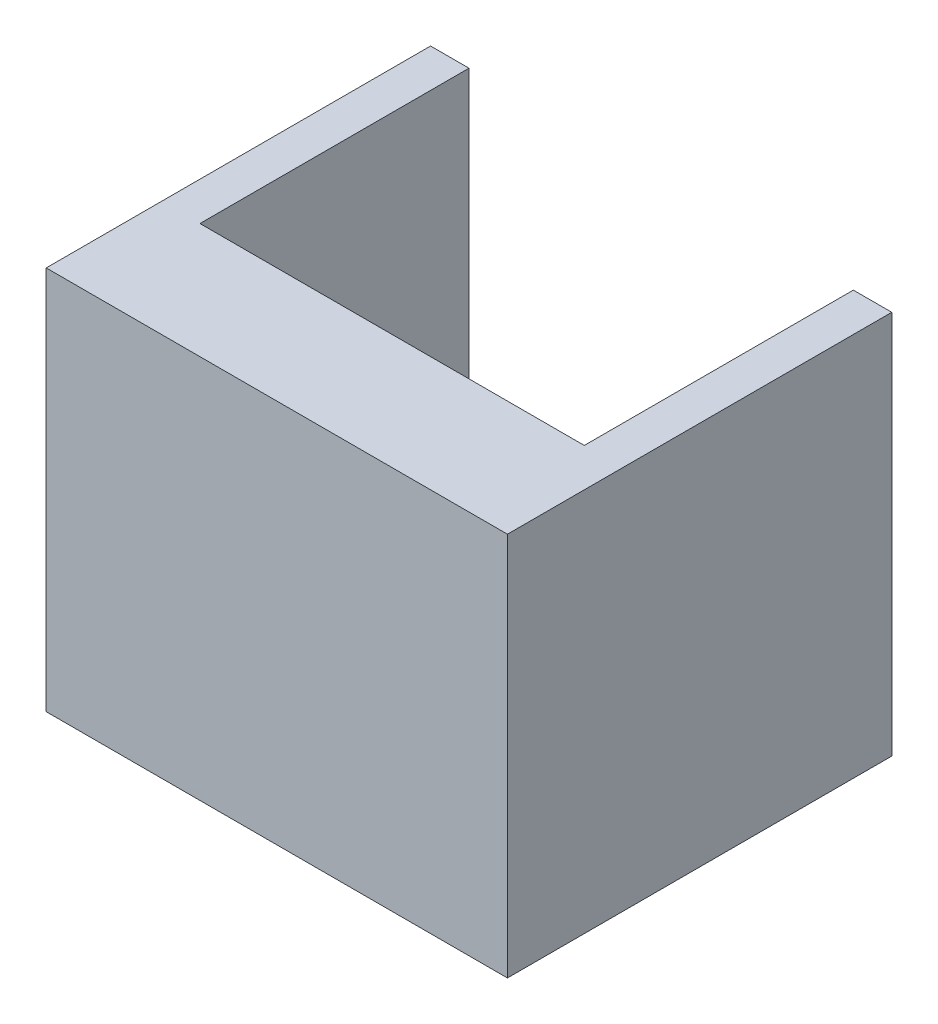
ISO-10303-21;
HEADER;
FILE_DESCRIPTION(('STEP AP214'),'2;1');
FILE_NAME('part.step','',(''),(''),'','','');
FILE_SCHEMA(('AUTOMOTIVE_DESIGN { 1 0 10303 214 1 1 1 1 }'));
ENDSEC;
DATA;
#1=APPLICATION_CONTEXT('core data for automotive mechanical design processes');
#2=APPLICATION_PROTOCOL_DEFINITION('international standard','automotive_design',2000,#1);
#3=PRODUCT_CONTEXT('',#1,'mechanical');
#4=PRODUCT('Part','Part','',(#3));
#5=PRODUCT_RELATED_PRODUCT_CATEGORY('part','',(#4));
#6=PRODUCT_DEFINITION_FORMATION('','',#4);
#7=PRODUCT_DEFINITION_CONTEXT('part definition',#1,'design');
#8=PRODUCT_DEFINITION('design','',#6,#7);
#9=PRODUCT_DEFINITION_SHAPE('','',#8);
#10=(LENGTH_UNIT() NAMED_UNIT(*) SI_UNIT(.MILLI.,.METRE.));
#11=(NAMED_UNIT(*) PLANE_ANGLE_UNIT() SI_UNIT($,.RADIAN.));
#12=(NAMED_UNIT(*) SI_UNIT($,.STERADIAN.) SOLID_ANGLE_UNIT());
#13=UNCERTAINTY_MEASURE_WITH_UNIT(LENGTH_MEASURE(1.E-05),#10,'distance_accuracy_value','');
#14=(GEOMETRIC_REPRESENTATION_CONTEXT(3) GLOBAL_UNCERTAINTY_ASSIGNED_CONTEXT((#13)) GLOBAL_UNIT_ASSIGNED_CONTEXT((#10,
#11,#12)) REPRESENTATION_CONTEXT('',''));
#15=CARTESIAN_POINT('',(0.,0.,0.));
#16=DIRECTION('',(0.,0.,1.));
#17=DIRECTION('',(1.,0.,0.));
#18=AXIS2_PLACEMENT_3D('',#15,#16,#17);
#19=CARTESIAN_POINT('',(3.59999999999999,10.,-5.11132252557189));
#20=DIRECTION('',(1.,0.,0.));
#21=DIRECTION('',(0.,0.,-1.));
#22=AXIS2_PLACEMENT_3D('',#19,#20,#21);
#23=PLANE('',#22);
#24=DIRECTION('',(0.,0.,1.));
#25=VECTOR('',#24,1.);
#26=CARTESIAN_POINT('',(3.59999999999999,0.,-5.11132252557189));
#27=LINE('',#26,#25);
#28=CARTESIAN_POINT('',(3.59999999999999,0.,-5.11132252557189));
#29=VERTEX_POINT('',#28);
#30=CARTESIAN_POINT('',(3.59999999999999,0.,4.88867747442811));
#31=VERTEX_POINT('',#30);
#32=EDGE_CURVE('E129',#29,#31,#27,.T.);
#33=ORIENTED_EDGE('',*,*,#32,.T.);
#34=DIRECTION('',(0.,-1.,0.));
#35=VECTOR('',#34,1.);
#36=CARTESIAN_POINT('',(3.59999999999999,10.,4.88867747442811));
#37=LINE('',#36,#35);
#38=CARTESIAN_POINT('',(3.59999999999999,10.,4.88867747442811));
#39=VERTEX_POINT('',#38);
#40=EDGE_CURVE('E11',#39,#31,#37,.T.);
#41=ORIENTED_EDGE('',*,*,#40,.F.);
#42=DIRECTION('',(0.,0.,1.));
#43=VECTOR('',#42,1.);
#44=CARTESIAN_POINT('',(3.59999999999999,10.,-5.11132252557189));
#45=LINE('',#44,#43);
#46=CARTESIAN_POINT('',(3.59999999999999,10.,-5.11132252557189));
#47=VERTEX_POINT('',#46);
#48=EDGE_CURVE('E143',#47,#39,#45,.T.);
#49=ORIENTED_EDGE('',*,*,#48,.F.);
#50=DIRECTION('',(0.,-1.,0.));
#51=VECTOR('',#50,1.);
#52=CARTESIAN_POINT('',(3.59999999999999,10.,-5.11132252557189));
#53=LINE('',#52,#51);
#54=EDGE_CURVE('E125',#47,#29,#53,.T.);
#55=ORIENTED_EDGE('',*,*,#54,.T.);
#56=EDGE_LOOP('',(#33,#41,#49,#55));
#57=FACE_BOUND('',#56,.T.);
#58=ADVANCED_FACE('F33',(#57),#23,.F.);
#59=CARTESIAN_POINT('',(3.59999999999999,10.,4.88867747442811));
#60=DIRECTION('',(0.,0.,-1.));
#61=DIRECTION('',(-1.,0.,0.));
#62=AXIS2_PLACEMENT_3D('',#59,#60,#61);
#63=PLANE('',#62);
#64=DIRECTION('',(1.,0.,0.));
#65=VECTOR('',#64,1.);
#66=CARTESIAN_POINT('',(3.59999999999999,0.,4.88867747442811));
#67=LINE('',#66,#65);
#68=CARTESIAN_POINT('',(15.6,0.,4.88867747442811));
#69=VERTEX_POINT('',#68);
#70=EDGE_CURVE('E132',#31,#69,#67,.T.);
#71=ORIENTED_EDGE('',*,*,#70,.T.);
#72=DIRECTION('',(0.,-1.,0.));
#73=VECTOR('',#72,1.);
#74=CARTESIAN_POINT('',(15.6,10.,4.88867747442811));
#75=LINE('',#74,#73);
#76=CARTESIAN_POINT('',(15.6,10.,4.88867747442811));
#77=VERTEX_POINT('',#76);
#78=EDGE_CURVE('E41',#77,#69,#75,.T.);
#79=ORIENTED_EDGE('',*,*,#78,.F.);
#80=DIRECTION('',(1.,0.,0.));
#81=VECTOR('',#80,1.);
#82=CARTESIAN_POINT('',(3.59999999999999,10.,4.88867747442811));
#83=LINE('',#82,#81);
#84=EDGE_CURVE('E92',#39,#77,#83,.T.);
#85=ORIENTED_EDGE('',*,*,#84,.F.);
#86=ORIENTED_EDGE('',*,*,#40,.T.);
#87=EDGE_LOOP('',(#71,#79,#85,#86));
#88=FACE_BOUND('',#87,.T.);
#89=ADVANCED_FACE('F178',(#88),#63,.F.);
#90=CARTESIAN_POINT('',(15.6,10.,-5.11132252557189));
#91=DIRECTION('',(-1.,0.,0.));
#92=DIRECTION('',(0.,0.,1.));
#93=AXIS2_PLACEMENT_3D('',#90,#91,#92);
#94=PLANE('',#93);
#95=DIRECTION('',(0.,0.,-1.));
#96=VECTOR('',#95,1.);
#97=CARTESIAN_POINT('',(15.6,0.,-5.11132252557189));
#98=LINE('',#97,#96);
#99=CARTESIAN_POINT('',(15.6,0.,-5.11132252557189));
#100=VERTEX_POINT('',#99);
#101=EDGE_CURVE('E134',#69,#100,#98,.T.);
#102=ORIENTED_EDGE('',*,*,#101,.T.);
#103=DIRECTION('',(0.,-1.,0.));
#104=VECTOR('',#103,1.);
#105=CARTESIAN_POINT('',(15.6,10.,-5.11132252557189));
#106=LINE('',#105,#104);
#107=CARTESIAN_POINT('',(15.6,10.,-5.11132252557189));
#108=VERTEX_POINT('',#107);
#109=EDGE_CURVE('E150',#108,#100,#106,.T.);
#110=ORIENTED_EDGE('',*,*,#109,.F.);
#111=DIRECTION('',(0.,0.,-1.));
#112=VECTOR('',#111,1.);
#113=CARTESIAN_POINT('',(15.6,10.,-5.11132252557189));
#114=LINE('',#113,#112);
#115=EDGE_CURVE('E158',#77,#108,#114,.T.);
#116=ORIENTED_EDGE('',*,*,#115,.F.);
#117=ORIENTED_EDGE('',*,*,#78,.T.);
#118=EDGE_LOOP('',(#102,#110,#116,#117));
#119=FACE_BOUND('',#118,.T.);
#120=ADVANCED_FACE('F156',(#119),#94,.F.);
#121=CARTESIAN_POINT('',(14.6,10.,-5.11132252557189));
#122=DIRECTION('',(0.,0.,1.));
#123=DIRECTION('',(1.,0.,0.));
#124=AXIS2_PLACEMENT_3D('',#121,#122,#123);
#125=PLANE('',#124);
#126=DIRECTION('',(-1.,0.,0.));
#127=VECTOR('',#126,1.);
#128=CARTESIAN_POINT('',(14.6,0.,-5.11132252557189));
#129=LINE('',#128,#127);
#130=CARTESIAN_POINT('',(14.6,0.,-5.11132252557189));
#131=VERTEX_POINT('',#130);
#132=EDGE_CURVE('E136',#100,#131,#129,.T.);
#133=ORIENTED_EDGE('',*,*,#132,.T.);
#134=DIRECTION('',(0.,-1.,0.));
#135=VECTOR('',#134,1.);
#136=CARTESIAN_POINT('',(14.6,10.,-5.11132252557189));
#137=LINE('',#136,#135);
#138=CARTESIAN_POINT('',(14.6,10.,-5.11132252557189));
#139=VERTEX_POINT('',#138);
#140=EDGE_CURVE('E147',#139,#131,#137,.T.);
#141=ORIENTED_EDGE('',*,*,#140,.F.);
#142=DIRECTION('',(-1.,0.,0.));
#143=VECTOR('',#142,1.);
#144=CARTESIAN_POINT('',(14.6,10.,-5.11132252557189));
#145=LINE('',#144,#143);
#146=EDGE_CURVE('E170',#108,#139,#145,.T.);
#147=ORIENTED_EDGE('',*,*,#146,.F.);
#148=ORIENTED_EDGE('',*,*,#109,.T.);
#149=EDGE_LOOP('',(#133,#141,#147,#148));
#150=FACE_BOUND('',#149,.T.);
#151=ADVANCED_FACE('F166',(#150),#125,.F.);
#152=CARTESIAN_POINT('',(14.6,10.,-5.11132252557189));
#153=DIRECTION('',(1.,0.,0.));
#154=DIRECTION('',(0.,0.,-1.));
#155=AXIS2_PLACEMENT_3D('',#152,#153,#154);
#156=PLANE('',#155);
#157=DIRECTION('',(0.,0.,1.));
#158=VECTOR('',#157,1.);
#159=CARTESIAN_POINT('',(14.6,0.,-5.11132252557189));
#160=LINE('',#159,#158);
#161=CARTESIAN_POINT('',(14.6,0.,1.88867747442811));
#162=VERTEX_POINT('',#161);
#163=EDGE_CURVE('E138',#131,#162,#160,.T.);
#164=ORIENTED_EDGE('',*,*,#163,.T.);
#165=DIRECTION('',(0.,-1.,0.));
#166=VECTOR('',#165,1.);
#167=CARTESIAN_POINT('',(14.6,10.,1.88867747442811));
#168=LINE('',#167,#166);
#169=CARTESIAN_POINT('',(14.6,10.,1.88867747442811));
#170=VERTEX_POINT('',#169);
#171=EDGE_CURVE('E120',#170,#162,#168,.T.);
#172=ORIENTED_EDGE('',*,*,#171,.F.);
#173=DIRECTION('',(0.,0.,1.));
#174=VECTOR('',#173,1.);
#175=CARTESIAN_POINT('',(14.6,10.,-5.11132252557189));
#176=LINE('',#175,#174);
#177=EDGE_CURVE('E111',#139,#170,#176,.T.);
#178=ORIENTED_EDGE('',*,*,#177,.F.);
#179=ORIENTED_EDGE('',*,*,#140,.T.);
#180=EDGE_LOOP('',(#164,#172,#178,#179));
#181=FACE_BOUND('',#180,.T.);
#182=ADVANCED_FACE('F169',(#181),#156,.F.);
#183=CARTESIAN_POINT('',(4.59999999999999,10.,1.88867747442811));
#184=DIRECTION('',(0.,0.,1.));
#185=DIRECTION('',(1.,0.,0.));
#186=AXIS2_PLACEMENT_3D('',#183,#184,#185);
#187=PLANE('',#186);
#188=DIRECTION('',(-1.,0.,0.));
#189=VECTOR('',#188,1.);
#190=CARTESIAN_POINT('',(4.59999999999999,0.,1.88867747442811));
#191=LINE('',#190,#189);
#192=CARTESIAN_POINT('',(4.59999999999999,0.,1.88867747442811));
#193=VERTEX_POINT('',#192);
#194=EDGE_CURVE('E119',#162,#193,#191,.T.);
#195=ORIENTED_EDGE('',*,*,#194,.T.);
#196=DIRECTION('',(0.,-1.,0.));
#197=VECTOR('',#196,1.);
#198=CARTESIAN_POINT('',(4.59999999999999,10.,1.88867747442811));
#199=LINE('',#198,#197);
#200=CARTESIAN_POINT('',(4.59999999999999,10.,1.88867747442811));
#201=VERTEX_POINT('',#200);
#202=EDGE_CURVE('E116',#201,#193,#199,.T.);
#203=ORIENTED_EDGE('',*,*,#202,.F.);
#204=DIRECTION('',(-1.,0.,0.));
#205=VECTOR('',#204,1.);
#206=CARTESIAN_POINT('',(4.59999999999999,10.,1.88867747442811));
#207=LINE('',#206,#205);
#208=EDGE_CURVE('E105',#170,#201,#207,.T.);
#209=ORIENTED_EDGE('',*,*,#208,.F.);
#210=ORIENTED_EDGE('',*,*,#171,.T.);
#211=EDGE_LOOP('',(#195,#203,#209,#210));
#212=FACE_BOUND('',#211,.T.);
#213=ADVANCED_FACE('F117',(#212),#187,.F.);
#214=CARTESIAN_POINT('',(4.59999999999999,10.,-5.11132252557189));
#215=DIRECTION('',(-1.,0.,0.));
#216=DIRECTION('',(0.,0.,1.));
#217=AXIS2_PLACEMENT_3D('',#214,#215,#216);
#218=PLANE('',#217);
#219=DIRECTION('',(0.,0.,-1.));
#220=VECTOR('',#219,1.);
#221=CARTESIAN_POINT('',(4.59999999999999,0.,-5.11132252557189));
#222=LINE('',#221,#220);
#223=CARTESIAN_POINT('',(4.59999999999999,0.,-5.11132252557189));
#224=VERTEX_POINT('',#223);
#225=EDGE_CURVE('E78',#193,#224,#222,.T.);
#226=ORIENTED_EDGE('',*,*,#225,.T.);
#227=DIRECTION('',(0.,-1.,0.));
#228=VECTOR('',#227,1.);
#229=CARTESIAN_POINT('',(4.59999999999999,10.,-5.11132252557189));
#230=LINE('',#229,#228);
#231=CARTESIAN_POINT('',(4.59999999999999,10.,-5.11132252557189));
#232=VERTEX_POINT('',#231);
#233=EDGE_CURVE('E121',#232,#224,#230,.T.);
#234=ORIENTED_EDGE('',*,*,#233,.F.);
#235=DIRECTION('',(0.,0.,-1.));
#236=VECTOR('',#235,1.);
#237=CARTESIAN_POINT('',(4.59999999999999,10.,-5.11132252557189));
#238=LINE('',#237,#236);
#239=EDGE_CURVE('E109',#201,#232,#238,.T.);
#240=ORIENTED_EDGE('',*,*,#239,.F.);
#241=ORIENTED_EDGE('',*,*,#202,.T.);
#242=EDGE_LOOP('',(#226,#234,#240,#241));
#243=FACE_BOUND('',#242,.T.);
#244=ADVANCED_FACE('F123',(#243),#218,.F.);
#245=CARTESIAN_POINT('',(3.59999999999999,10.,-5.11132252557189));
#246=DIRECTION('',(0.,0.,1.));
#247=DIRECTION('',(1.,0.,0.));
#248=AXIS2_PLACEMENT_3D('',#245,#246,#247);
#249=PLANE('',#248);
#250=DIRECTION('',(-1.,0.,0.));
#251=VECTOR('',#250,1.);
#252=CARTESIAN_POINT('',(3.59999999999999,0.,-5.11132252557189));
#253=LINE('',#252,#251);
#254=EDGE_CURVE('E84',#224,#29,#253,.T.);
#255=ORIENTED_EDGE('',*,*,#254,.T.);
#256=ORIENTED_EDGE('',*,*,#54,.F.);
#257=DIRECTION('',(-1.,0.,0.));
#258=VECTOR('',#257,1.);
#259=CARTESIAN_POINT('',(3.59999999999999,10.,-5.11132252557189));
#260=LINE('',#259,#258);
#261=EDGE_CURVE('E49',#232,#47,#260,.T.);
#262=ORIENTED_EDGE('',*,*,#261,.F.);
#263=ORIENTED_EDGE('',*,*,#233,.T.);
#264=EDGE_LOOP('',(#255,#256,#262,#263));
#265=FACE_BOUND('',#264,.T.);
#266=ADVANCED_FACE('F194',(#265),#249,.F.);
#267=CARTESIAN_POINT('',(0.,10.,0.));
#268=DIRECTION('',(0.,1.,0.));
#269=DIRECTION('',(0.,0.,1.));
#270=AXIS2_PLACEMENT_3D('',#267,#268,#269);
#271=PLANE('',#270);
#272=ORIENTED_EDGE('',*,*,#48,.T.);
#273=ORIENTED_EDGE('',*,*,#84,.T.);
#274=ORIENTED_EDGE('',*,*,#115,.T.);
#275=ORIENTED_EDGE('',*,*,#146,.T.);
#276=ORIENTED_EDGE('',*,*,#177,.T.);
#277=ORIENTED_EDGE('',*,*,#208,.T.);
#278=ORIENTED_EDGE('',*,*,#239,.T.);
#279=ORIENTED_EDGE('',*,*,#261,.T.);
#280=EDGE_LOOP('',(#272,#273,#274,#275,#276,#277,#278,#279));
#281=FACE_BOUND('',#280,.T.);
#282=ADVANCED_FACE('F107',(#281),#271,.T.);
#283=CARTESIAN_POINT('',(0.,0.,0.));
#284=DIRECTION('',(0.,1.,0.));
#285=DIRECTION('',(0.,0.,1.));
#286=AXIS2_PLACEMENT_3D('',#283,#284,#285);
#287=PLANE('',#286);
#288=ORIENTED_EDGE('',*,*,#32,.F.);
#289=ORIENTED_EDGE('',*,*,#254,.F.);
#290=ORIENTED_EDGE('',*,*,#225,.F.);
#291=ORIENTED_EDGE('',*,*,#194,.F.);
#292=ORIENTED_EDGE('',*,*,#163,.F.);
#293=ORIENTED_EDGE('',*,*,#132,.F.);
#294=ORIENTED_EDGE('',*,*,#101,.F.);
#295=ORIENTED_EDGE('',*,*,#70,.F.);
#296=EDGE_LOOP('',(#288,#289,#290,#291,#292,#293,#294,#295));
#297=FACE_BOUND('',#296,.T.);
#298=ADVANCED_FACE('F162',(#297),#287,.F.);
#299=CLOSED_SHELL('',(#58,#89,#120,#151,#182,#213,#244,#266,#282,#298));
#300=MANIFOLD_SOLID_BREP('B2',#299);
#301=ADVANCED_BREP_SHAPE_REPRESENTATION('',(#18,#300),#14);
#302=SHAPE_DEFINITION_REPRESENTATION(#9,#301);
ENDSEC;
END-ISO-10303-21;
